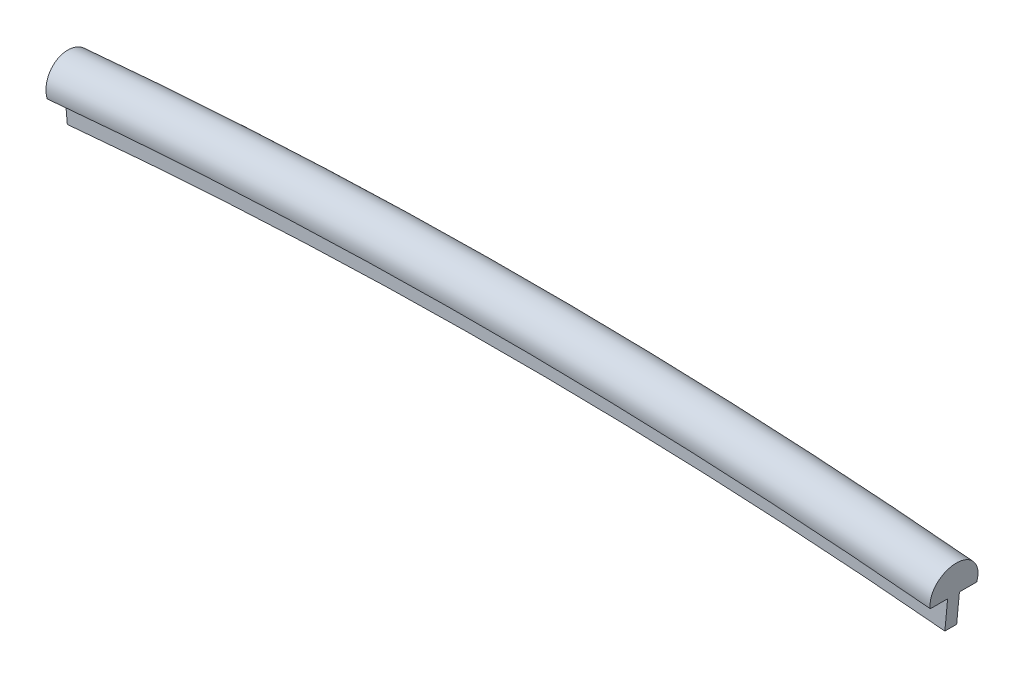
ISO-10303-21;
HEADER;
FILE_DESCRIPTION(('STEP AP214'),'2;1');
FILE_NAME('part.step','',(''),(''),'','','');
FILE_SCHEMA(('AUTOMOTIVE_DESIGN { 1 0 10303 214 1 1 1 1 }'));
ENDSEC;
DATA;
#1=APPLICATION_CONTEXT('core data for automotive mechanical design processes');
#2=APPLICATION_PROTOCOL_DEFINITION('international standard','automotive_design',2000,#1);
#3=PRODUCT_CONTEXT('',#1,'mechanical');
#4=PRODUCT('Part','Part','',(#3));
#5=PRODUCT_RELATED_PRODUCT_CATEGORY('part','',(#4));
#6=PRODUCT_DEFINITION_FORMATION('','',#4);
#7=PRODUCT_DEFINITION_CONTEXT('part definition',#1,'design');
#8=PRODUCT_DEFINITION('design','',#6,#7);
#9=PRODUCT_DEFINITION_SHAPE('','',#8);
#10=(LENGTH_UNIT() NAMED_UNIT(*) SI_UNIT(.MILLI.,.METRE.));
#11=(NAMED_UNIT(*) PLANE_ANGLE_UNIT() SI_UNIT($,.RADIAN.));
#12=(NAMED_UNIT(*) SI_UNIT($,.STERADIAN.) SOLID_ANGLE_UNIT());
#13=UNCERTAINTY_MEASURE_WITH_UNIT(LENGTH_MEASURE(1.E-05),#10,'distance_accuracy_value','');
#14=(GEOMETRIC_REPRESENTATION_CONTEXT(3) GLOBAL_UNCERTAINTY_ASSIGNED_CONTEXT((#13)) GLOBAL_UNIT_ASSIGNED_CONTEXT((#10,
#11,#12)) REPRESENTATION_CONTEXT('',''));
#15=CARTESIAN_POINT('',(0.,0.,0.));
#16=DIRECTION('',(0.,0.,1.));
#17=DIRECTION('',(1.,0.,0.));
#18=AXIS2_PLACEMENT_3D('',#15,#16,#17);
#19=CARTESIAN_POINT('',(0.,0.,70.5976415970385));
#20=DIRECTION('',(0.,0.,1.));
#21=DIRECTION('',(1.,0.,0.));
#22=AXIS2_PLACEMENT_3D('',#19,#20,#21);
#23=CYLINDRICAL_SURFACE('',#22,241.3);
#24=CARTESIAN_POINT('',(0.,0.,1.18));
#25=DIRECTION('',(0.,0.,1.));
#26=DIRECTION('',(1.,0.,0.));
#27=AXIS2_PLACEMENT_3D('',#24,#25,#26);
#28=CIRCLE('',#27,241.3);
#29=CARTESIAN_POINT('',(22.4524933917935,240.253148866964,1.18));
#30=VERTEX_POINT('',#29);
#31=CARTESIAN_POINT('',(-22.4524933917935,240.253148866964,1.18));
#32=VERTEX_POINT('',#31);
#33=EDGE_CURVE('E11',#30,#32,#28,.T.);
#34=ORIENTED_EDGE('',*,*,#33,.T.);
#35=DIRECTION('',(0.,0.,-1.));
#36=VECTOR('',#35,1.);
#37=CARTESIAN_POINT('',(-22.4524933917935,240.253148866964,1.18));
#38=LINE('',#37,#36);
#39=CARTESIAN_POINT('',(-22.4524933917935,240.253148866964,0.3));
#40=VERTEX_POINT('',#39);
#41=EDGE_CURVE('E103',#32,#40,#38,.T.);
#42=ORIENTED_EDGE('',*,*,#41,.T.);
#43=CARTESIAN_POINT('',(0.,0.,0.299999999999995));
#44=DIRECTION('',(0.,0.,1.));
#45=DIRECTION('',(1.,0.,0.));
#46=AXIS2_PLACEMENT_3D('',#43,#44,#45);
#47=CIRCLE('',#46,241.3);
#48=CARTESIAN_POINT('',(22.4524933917935,240.253148866964,0.3));
#49=VERTEX_POINT('',#48);
#50=EDGE_CURVE('E85',#49,#40,#47,.T.);
#51=ORIENTED_EDGE('',*,*,#50,.F.);
#52=DIRECTION('',(0.,0.,-1.));
#53=VECTOR('',#52,1.);
#54=CARTESIAN_POINT('',(22.4524933917935,240.253148866964,1.18));
#55=LINE('',#54,#53);
#56=EDGE_CURVE('E117',#30,#49,#55,.T.);
#57=ORIENTED_EDGE('',*,*,#56,.F.);
#58=EDGE_LOOP('',(#34,#42,#51,#57));
#59=FACE_BOUND('',#58,.T.);
#60=ADVANCED_FACE('F33',(#59),#23,.F.);
#61=CARTESIAN_POINT('',(0.,0.,0.));
#62=DIRECTION('',(0.,0.,1.));
#63=DIRECTION('',(1.,0.,0.));
#64=AXIS2_PLACEMENT_3D('',#61,#62,#63);
#65=TOROIDAL_SURFACE('',#64,241.586013989906,1.21416802890791);
#66=CARTESIAN_POINT('',(0.,0.,-1.18));
#67=DIRECTION('',(0.,0.,1.));
#68=DIRECTION('',(1.,0.,0.));
#69=AXIS2_PLACEMENT_3D('',#66,#67,#68);
#70=CIRCLE('',#69,241.3);
#71=CARTESIAN_POINT('',(22.4524933917935,240.253148866964,-1.18));
#72=VERTEX_POINT('',#71);
#73=CARTESIAN_POINT('',(-22.4524933917935,240.253148866964,-1.18));
#74=VERTEX_POINT('',#73);
#75=EDGE_CURVE('E41',#72,#74,#70,.T.);
#76=ORIENTED_EDGE('',*,*,#75,.T.);
#77=CARTESIAN_POINT('',(-22.4791064345549,240.53792201945,0.));
#78=DIRECTION('',(0.995661619838225,0.0930480455523975,0.));
#79=DIRECTION('',(0.,0.,1.));
#80=AXIS2_PLACEMENT_3D('',#77,#78,#79);
#81=CIRCLE('',#80,1.21416802890791);
#82=EDGE_CURVE('E115',#74,#32,#81,.T.);
#83=ORIENTED_EDGE('',*,*,#82,.T.);
#84=ORIENTED_EDGE('',*,*,#33,.F.);
#85=CARTESIAN_POINT('',(22.4791064345549,240.53792201945,0.));
#86=DIRECTION('',(0.995661619838226,-0.0930480455523975,0.));
#87=DIRECTION('',(0.,0.,1.));
#88=AXIS2_PLACEMENT_3D('',#85,#86,#87);
#89=CIRCLE('',#88,1.21416802890791);
#90=EDGE_CURVE('E97',#72,#30,#89,.T.);
#91=ORIENTED_EDGE('',*,*,#90,.F.);
#92=EDGE_LOOP('',(#76,#83,#84,#91));
#93=FACE_BOUND('',#92,.T.);
#94=ADVANCED_FACE('F35',(#93),#65,.T.);
#95=CARTESIAN_POINT('',(0.,0.,70.5976415970385));
#96=DIRECTION('',(0.,0.,1.));
#97=DIRECTION('',(1.,0.,0.));
#98=AXIS2_PLACEMENT_3D('',#95,#96,#97);
#99=CYLINDRICAL_SURFACE('',#98,241.3);
#100=CARTESIAN_POINT('',(0.,0.,-0.299999999999995));
#101=DIRECTION('',(0.,0.,1.));
#102=DIRECTION('',(1.,0.,0.));
#103=AXIS2_PLACEMENT_3D('',#100,#101,#102);
#104=CIRCLE('',#103,241.3);
#105=CARTESIAN_POINT('',(22.4524933917935,240.253148866964,-0.3));
#106=VERTEX_POINT('',#105);
#107=CARTESIAN_POINT('',(-22.4524933917935,240.253148866964,-0.3));
#108=VERTEX_POINT('',#107);
#109=EDGE_CURVE('E132',#106,#108,#104,.T.);
#110=ORIENTED_EDGE('',*,*,#109,.T.);
#111=DIRECTION('',(0.,0.,-1.));
#112=VECTOR('',#111,1.);
#113=CARTESIAN_POINT('',(-22.4524933917935,240.253148866964,-0.3));
#114=LINE('',#113,#112);
#115=EDGE_CURVE('E113',#108,#74,#114,.T.);
#116=ORIENTED_EDGE('',*,*,#115,.T.);
#117=ORIENTED_EDGE('',*,*,#75,.F.);
#118=DIRECTION('',(0.,0.,-1.));
#119=VECTOR('',#118,1.);
#120=CARTESIAN_POINT('',(22.4524933917935,240.253148866964,-0.3));
#121=LINE('',#120,#119);
#122=EDGE_CURVE('E125',#106,#72,#121,.T.);
#123=ORIENTED_EDGE('',*,*,#122,.F.);
#124=EDGE_LOOP('',(#110,#116,#117,#123));
#125=FACE_BOUND('',#124,.T.);
#126=ADVANCED_FACE('F134',(#125),#99,.F.);
#127=CARTESIAN_POINT('',(22.3129213234649,238.759656437206,-0.3));
#128=DIRECTION('',(0.,0.,1.));
#129=DIRECTION('',(1.,0.,0.));
#130=AXIS2_PLACEMENT_3D('',#127,#128,#129);
#131=PLANE('',#130);
#132=CARTESIAN_POINT('',(0.,0.,-0.299999999999995));
#133=DIRECTION('',(0.,0.,1.));
#134=DIRECTION('',(1.,0.,0.));
#135=AXIS2_PLACEMENT_3D('',#132,#133,#134);
#136=CIRCLE('',#135,239.8);
#137=CARTESIAN_POINT('',(22.3129213234649,238.759656437206,-0.3));
#138=VERTEX_POINT('',#137);
#139=CARTESIAN_POINT('',(-22.3129213234649,238.759656437206,-0.3));
#140=VERTEX_POINT('',#139);
#141=EDGE_CURVE('E129',#138,#140,#136,.T.);
#142=ORIENTED_EDGE('',*,*,#141,.T.);
#143=DIRECTION('',(-0.0930480455523975,0.995661619838225,0.));
#144=VECTOR('',#143,1.);
#145=CARTESIAN_POINT('',(-22.3129213234649,238.759656437206,-0.3));
#146=LINE('',#145,#144);
#147=EDGE_CURVE('E110',#140,#108,#146,.T.);
#148=ORIENTED_EDGE('',*,*,#147,.T.);
#149=ORIENTED_EDGE('',*,*,#109,.F.);
#150=DIRECTION('',(0.0930480455523975,0.995661619838226,0.));
#151=VECTOR('',#150,1.);
#152=CARTESIAN_POINT('',(22.3129213234649,238.759656437206,-0.3));
#153=LINE('',#152,#151);
#154=EDGE_CURVE('E122',#138,#106,#153,.T.);
#155=ORIENTED_EDGE('',*,*,#154,.F.);
#156=EDGE_LOOP('',(#142,#148,#149,#155));
#157=FACE_BOUND('',#156,.T.);
#158=ADVANCED_FACE('F136',(#157),#131,.F.);
#159=CARTESIAN_POINT('',(0.,0.,70.5976415970385));
#160=DIRECTION('',(0.,0.,1.));
#161=DIRECTION('',(1.,0.,0.));
#162=AXIS2_PLACEMENT_3D('',#159,#160,#161);
#163=CYLINDRICAL_SURFACE('',#162,239.8);
#164=CARTESIAN_POINT('',(0.,0.,0.299999999999995));
#165=DIRECTION('',(0.,0.,1.));
#166=DIRECTION('',(1.,0.,0.));
#167=AXIS2_PLACEMENT_3D('',#164,#165,#166);
#168=CIRCLE('',#167,239.8);
#169=CARTESIAN_POINT('',(22.3129213234649,238.759656437206,0.3));
#170=VERTEX_POINT('',#169);
#171=CARTESIAN_POINT('',(-22.3129213234649,238.759656437206,0.3));
#172=VERTEX_POINT('',#171);
#173=EDGE_CURVE('E96',#170,#172,#168,.T.);
#174=ORIENTED_EDGE('',*,*,#173,.T.);
#175=DIRECTION('',(0.,0.,-1.));
#176=VECTOR('',#175,1.);
#177=CARTESIAN_POINT('',(-22.3129213234649,238.759656437206,0.));
#178=LINE('',#177,#176);
#179=EDGE_CURVE('E105',#172,#140,#178,.T.);
#180=ORIENTED_EDGE('',*,*,#179,.T.);
#181=ORIENTED_EDGE('',*,*,#141,.F.);
#182=DIRECTION('',(0.,0.,-1.));
#183=VECTOR('',#182,1.);
#184=CARTESIAN_POINT('',(22.3129213234649,238.759656437206,0.));
#185=LINE('',#184,#183);
#186=EDGE_CURVE('E120',#170,#138,#185,.T.);
#187=ORIENTED_EDGE('',*,*,#186,.F.);
#188=EDGE_LOOP('',(#174,#180,#181,#187));
#189=FACE_BOUND('',#188,.T.);
#190=ADVANCED_FACE('F141',(#189),#163,.F.);
#191=CARTESIAN_POINT('',(22.3129213234649,238.759656437206,0.3));
#192=DIRECTION('',(0.,0.,-1.));
#193=DIRECTION('',(-1.,0.,0.));
#194=AXIS2_PLACEMENT_3D('',#191,#192,#193);
#195=PLANE('',#194);
#196=DIRECTION('',(-0.0930480455523975,-0.995661619838226,0.));
#197=VECTOR('',#196,1.);
#198=CARTESIAN_POINT('',(22.3129213234649,238.759656437206,0.3));
#199=LINE('',#198,#197);
#200=EDGE_CURVE('E91',#49,#170,#199,.T.);
#201=ORIENTED_EDGE('',*,*,#200,.F.);
#202=ORIENTED_EDGE('',*,*,#50,.T.);
#203=DIRECTION('',(0.0930480455523975,-0.995661619838225,0.));
#204=VECTOR('',#203,1.);
#205=CARTESIAN_POINT('',(-22.3129213234649,238.759656437206,0.3));
#206=LINE('',#205,#204);
#207=EDGE_CURVE('E88',#40,#172,#206,.T.);
#208=ORIENTED_EDGE('',*,*,#207,.T.);
#209=ORIENTED_EDGE('',*,*,#173,.F.);
#210=EDGE_LOOP('',(#201,#202,#208,#209));
#211=FACE_BOUND('',#210,.T.);
#212=ADVANCED_FACE('F87',(#211),#195,.F.);
#213=CARTESIAN_POINT('',(22.4791064345549,240.53792201945,0.));
#214=DIRECTION('',(-0.995661619838226,0.0930480455523975,0.));
#215=DIRECTION('',(0.,0.,1.));
#216=AXIS2_PLACEMENT_3D('',#213,#214,#215);
#217=PLANE('',#216);
#218=ORIENTED_EDGE('',*,*,#56,.T.);
#219=ORIENTED_EDGE('',*,*,#200,.T.);
#220=ORIENTED_EDGE('',*,*,#186,.T.);
#221=ORIENTED_EDGE('',*,*,#154,.T.);
#222=ORIENTED_EDGE('',*,*,#122,.T.);
#223=ORIENTED_EDGE('',*,*,#90,.T.);
#224=EDGE_LOOP('',(#218,#219,#220,#221,#222,#223));
#225=FACE_BOUND('',#224,.T.);
#226=ADVANCED_FACE('F143',(#225),#217,.F.);
#227=CARTESIAN_POINT('',(-22.4791064345549,240.53792201945,0.));
#228=DIRECTION('',(-0.995661619838225,-0.0930480455523975,0.));
#229=DIRECTION('',(0.,0.,1.));
#230=AXIS2_PLACEMENT_3D('',#227,#228,#229);
#231=PLANE('',#230);
#232=ORIENTED_EDGE('',*,*,#41,.F.);
#233=ORIENTED_EDGE('',*,*,#82,.F.);
#234=ORIENTED_EDGE('',*,*,#115,.F.);
#235=ORIENTED_EDGE('',*,*,#147,.F.);
#236=ORIENTED_EDGE('',*,*,#179,.F.);
#237=ORIENTED_EDGE('',*,*,#207,.F.);
#238=EDGE_LOOP('',(#232,#233,#234,#235,#236,#237));
#239=FACE_BOUND('',#238,.T.);
#240=ADVANCED_FACE('F101',(#239),#231,.T.);
#241=CLOSED_SHELL('',(#60,#94,#126,#158,#190,#212,#226,#240));
#242=MANIFOLD_SOLID_BREP('B2',#241);
#243=ADVANCED_BREP_SHAPE_REPRESENTATION('',(#18,#242),#14);
#244=SHAPE_DEFINITION_REPRESENTATION(#9,#243);
ENDSEC;
END-ISO-10303-21;
